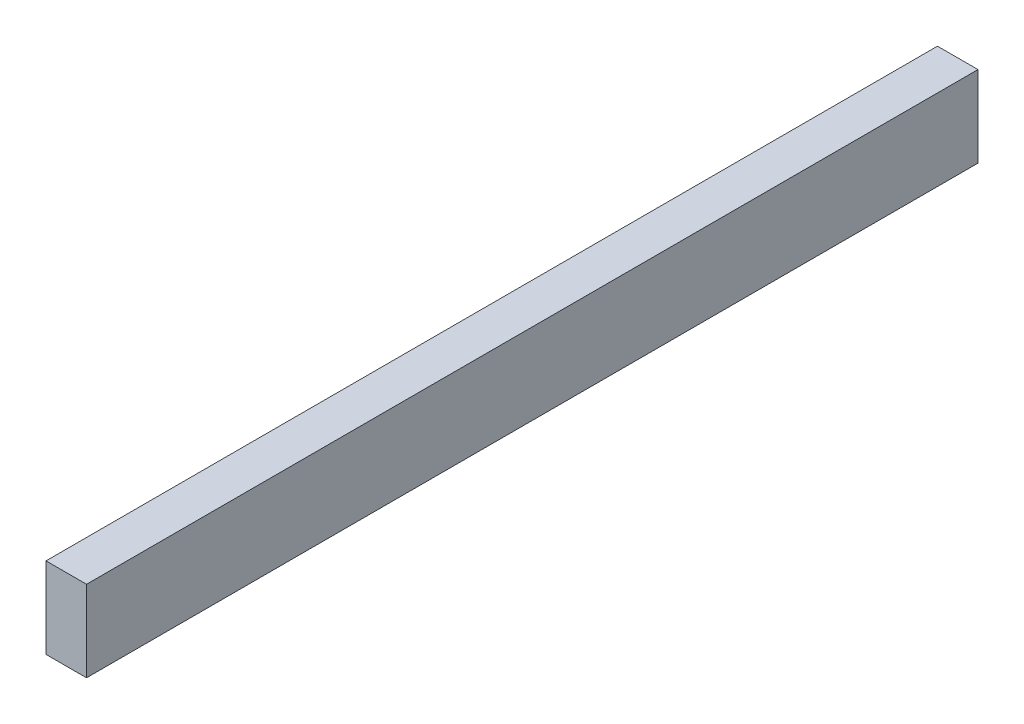
ISO-10303-21;
HEADER;
FILE_DESCRIPTION(('STEP AP214'),'2;1');
FILE_NAME('part.step','',(''),(''),'','','');
FILE_SCHEMA(('AUTOMOTIVE_DESIGN { 1 0 10303 214 1 1 1 1 }'));
ENDSEC;
DATA;
#1=APPLICATION_CONTEXT('core data for automotive mechanical design processes');
#2=APPLICATION_PROTOCOL_DEFINITION('international standard','automotive_design',2000,#1);
#3=PRODUCT_CONTEXT('',#1,'mechanical');
#4=PRODUCT('Part','Part','',(#3));
#5=PRODUCT_RELATED_PRODUCT_CATEGORY('part','',(#4));
#6=PRODUCT_DEFINITION_FORMATION('','',#4);
#7=PRODUCT_DEFINITION_CONTEXT('part definition',#1,'design');
#8=PRODUCT_DEFINITION('design','',#6,#7);
#9=PRODUCT_DEFINITION_SHAPE('','',#8);
#10=(LENGTH_UNIT() NAMED_UNIT(*) SI_UNIT(.MILLI.,.METRE.));
#11=(NAMED_UNIT(*) PLANE_ANGLE_UNIT() SI_UNIT($,.RADIAN.));
#12=(NAMED_UNIT(*) SI_UNIT($,.STERADIAN.) SOLID_ANGLE_UNIT());
#13=UNCERTAINTY_MEASURE_WITH_UNIT(LENGTH_MEASURE(1.E-05),#10,'distance_accuracy_value','');
#14=(GEOMETRIC_REPRESENTATION_CONTEXT(3) GLOBAL_UNCERTAINTY_ASSIGNED_CONTEXT((#13)) GLOBAL_UNIT_ASSIGNED_CONTEXT((#10,
#11,#12)) REPRESENTATION_CONTEXT('',''));
#15=CARTESIAN_POINT('',(0.,0.,0.));
#16=DIRECTION('',(0.,0.,1.));
#17=DIRECTION('',(1.,0.,0.));
#18=AXIS2_PLACEMENT_3D('',#15,#16,#17);
#19=CARTESIAN_POINT('',(-1.5875,-3.175,69.85));
#20=DIRECTION('',(1.,0.,0.));
#21=DIRECTION('',(0.,0.,-1.));
#22=AXIS2_PLACEMENT_3D('',#19,#20,#21);
#23=PLANE('',#22);
#24=DIRECTION('',(0.,-1.,0.));
#25=VECTOR('',#24,1.);
#26=CARTESIAN_POINT('',(-1.5875,-3.175,0.));
#27=LINE('',#26,#25);
#28=CARTESIAN_POINT('',(-1.5875,3.175,0.));
#29=VERTEX_POINT('',#28);
#30=CARTESIAN_POINT('',(-1.5875,-3.175,0.));
#31=VERTEX_POINT('',#30);
#32=EDGE_CURVE('E96',#29,#31,#27,.T.);
#33=ORIENTED_EDGE('',*,*,#32,.T.);
#34=DIRECTION('',(0.,0.,-1.));
#35=VECTOR('',#34,1.);
#36=CARTESIAN_POINT('',(-1.5875,-3.175,69.85));
#37=LINE('',#36,#35);
#38=CARTESIAN_POINT('',(-1.5875,-3.175,69.85));
#39=VERTEX_POINT('',#38);
#40=EDGE_CURVE('E11',#39,#31,#37,.T.);
#41=ORIENTED_EDGE('',*,*,#40,.F.);
#42=DIRECTION('',(0.,-1.,0.));
#43=VECTOR('',#42,1.);
#44=CARTESIAN_POINT('',(-1.5875,-3.175,69.85));
#45=LINE('',#44,#43);
#46=CARTESIAN_POINT('',(-1.5875,3.175,69.85));
#47=VERTEX_POINT('',#46);
#48=EDGE_CURVE('E84',#47,#39,#45,.T.);
#49=ORIENTED_EDGE('',*,*,#48,.F.);
#50=DIRECTION('',(0.,0.,-1.));
#51=VECTOR('',#50,1.);
#52=CARTESIAN_POINT('',(-1.5875,3.175,69.85));
#53=LINE('',#52,#51);
#54=EDGE_CURVE('E92',#47,#29,#53,.T.);
#55=ORIENTED_EDGE('',*,*,#54,.T.);
#56=EDGE_LOOP('',(#33,#41,#49,#55));
#57=FACE_BOUND('',#56,.T.);
#58=ADVANCED_FACE('F33',(#57),#23,.F.);
#59=CARTESIAN_POINT('',(1.5875,-3.175,69.85));
#60=DIRECTION('',(0.,1.,0.));
#61=DIRECTION('',(0.,0.,1.));
#62=AXIS2_PLACEMENT_3D('',#59,#60,#61);
#63=PLANE('',#62);
#64=DIRECTION('',(1.,0.,0.));
#65=VECTOR('',#64,1.);
#66=CARTESIAN_POINT('',(1.5875,-3.175,0.));
#67=LINE('',#66,#65);
#68=CARTESIAN_POINT('',(1.5875,-3.175,0.));
#69=VERTEX_POINT('',#68);
#70=EDGE_CURVE('E88',#31,#69,#67,.T.);
#71=ORIENTED_EDGE('',*,*,#70,.T.);
#72=DIRECTION('',(0.,0.,-1.));
#73=VECTOR('',#72,1.);
#74=CARTESIAN_POINT('',(1.5875,-3.175,69.85));
#75=LINE('',#74,#73);
#76=CARTESIAN_POINT('',(1.5875,-3.175,69.85));
#77=VERTEX_POINT('',#76);
#78=EDGE_CURVE('E41',#77,#69,#75,.T.);
#79=ORIENTED_EDGE('',*,*,#78,.F.);
#80=DIRECTION('',(1.,0.,0.));
#81=VECTOR('',#80,1.);
#82=CARTESIAN_POINT('',(1.5875,-3.175,69.85));
#83=LINE('',#82,#81);
#84=EDGE_CURVE('E79',#39,#77,#83,.T.);
#85=ORIENTED_EDGE('',*,*,#84,.F.);
#86=ORIENTED_EDGE('',*,*,#40,.T.);
#87=EDGE_LOOP('',(#71,#79,#85,#86));
#88=FACE_BOUND('',#87,.T.);
#89=ADVANCED_FACE('F87',(#88),#63,.F.);
#90=CARTESIAN_POINT('',(1.5875,-3.175,69.85));
#91=DIRECTION('',(-1.,0.,0.));
#92=DIRECTION('',(0.,0.,1.));
#93=AXIS2_PLACEMENT_3D('',#90,#91,#92);
#94=PLANE('',#93);
#95=DIRECTION('',(0.,1.,0.));
#96=VECTOR('',#95,1.);
#97=CARTESIAN_POINT('',(1.5875,-3.175,0.));
#98=LINE('',#97,#96);
#99=CARTESIAN_POINT('',(1.5875,3.175,0.));
#100=VERTEX_POINT('',#99);
#101=EDGE_CURVE('E66',#69,#100,#98,.T.);
#102=ORIENTED_EDGE('',*,*,#101,.T.);
#103=DIRECTION('',(0.,0.,-1.));
#104=VECTOR('',#103,1.);
#105=CARTESIAN_POINT('',(1.5875,3.175,69.85));
#106=LINE('',#105,#104);
#107=CARTESIAN_POINT('',(1.5875,3.175,69.85));
#108=VERTEX_POINT('',#107);
#109=EDGE_CURVE('E89',#108,#100,#106,.T.);
#110=ORIENTED_EDGE('',*,*,#109,.F.);
#111=DIRECTION('',(0.,1.,0.));
#112=VECTOR('',#111,1.);
#113=CARTESIAN_POINT('',(1.5875,-3.175,69.85));
#114=LINE('',#113,#112);
#115=EDGE_CURVE('E82',#77,#108,#114,.T.);
#116=ORIENTED_EDGE('',*,*,#115,.F.);
#117=ORIENTED_EDGE('',*,*,#78,.T.);
#118=EDGE_LOOP('',(#102,#110,#116,#117));
#119=FACE_BOUND('',#118,.T.);
#120=ADVANCED_FACE('F90',(#119),#94,.F.);
#121=CARTESIAN_POINT('',(1.5875,3.175,69.85));
#122=DIRECTION('',(0.,-1.,0.));
#123=DIRECTION('',(0.,0.,-1.));
#124=AXIS2_PLACEMENT_3D('',#121,#122,#123);
#125=PLANE('',#124);
#126=DIRECTION('',(-1.,0.,0.));
#127=VECTOR('',#126,1.);
#128=CARTESIAN_POINT('',(1.5875,3.175,0.));
#129=LINE('',#128,#127);
#130=EDGE_CURVE('E72',#100,#29,#129,.T.);
#131=ORIENTED_EDGE('',*,*,#130,.T.);
#132=ORIENTED_EDGE('',*,*,#54,.F.);
#133=DIRECTION('',(-1.,0.,0.));
#134=VECTOR('',#133,1.);
#135=CARTESIAN_POINT('',(1.5875,3.175,69.85));
#136=LINE('',#135,#134);
#137=EDGE_CURVE('E49',#108,#47,#136,.T.);
#138=ORIENTED_EDGE('',*,*,#137,.F.);
#139=ORIENTED_EDGE('',*,*,#109,.T.);
#140=EDGE_LOOP('',(#131,#132,#138,#139));
#141=FACE_BOUND('',#140,.T.);
#142=ADVANCED_FACE('F103',(#141),#125,.F.);
#143=CARTESIAN_POINT('',(0.,0.,69.85));
#144=DIRECTION('',(0.,0.,1.));
#145=DIRECTION('',(1.,0.,0.));
#146=AXIS2_PLACEMENT_3D('',#143,#144,#145);
#147=PLANE('',#146);
#148=ORIENTED_EDGE('',*,*,#48,.T.);
#149=ORIENTED_EDGE('',*,*,#84,.T.);
#150=ORIENTED_EDGE('',*,*,#115,.T.);
#151=ORIENTED_EDGE('',*,*,#137,.T.);
#152=EDGE_LOOP('',(#148,#149,#150,#151));
#153=FACE_BOUND('',#152,.T.);
#154=ADVANCED_FACE('F80',(#153),#147,.T.);
#155=CARTESIAN_POINT('',(0.,0.,0.));
#156=DIRECTION('',(0.,0.,1.));
#157=DIRECTION('',(1.,0.,0.));
#158=AXIS2_PLACEMENT_3D('',#155,#156,#157);
#159=PLANE('',#158);
#160=ORIENTED_EDGE('',*,*,#32,.F.);
#161=ORIENTED_EDGE('',*,*,#130,.F.);
#162=ORIENTED_EDGE('',*,*,#101,.F.);
#163=ORIENTED_EDGE('',*,*,#70,.F.);
#164=EDGE_LOOP('',(#160,#161,#162,#163));
#165=FACE_BOUND('',#164,.T.);
#166=ADVANCED_FACE('F106',(#165),#159,.F.);
#167=CLOSED_SHELL('',(#58,#89,#120,#142,#154,#166));
#168=MANIFOLD_SOLID_BREP('B2',#167);
#169=ADVANCED_BREP_SHAPE_REPRESENTATION('',(#18,#168),#14);
#170=SHAPE_DEFINITION_REPRESENTATION(#9,#169);
ENDSEC;
END-ISO-10303-21;
